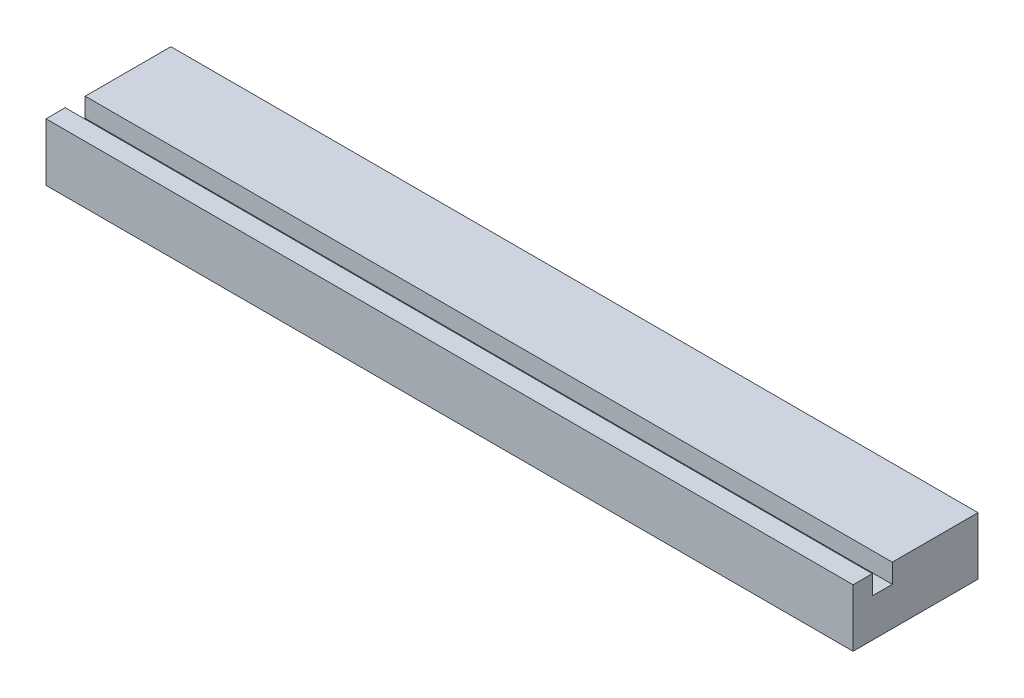
ISO-10303-21;
HEADER;
FILE_DESCRIPTION(('STEP AP214'),'2;1');
FILE_NAME('part.step','',(''),(''),'','','');
FILE_SCHEMA(('AUTOMOTIVE_DESIGN { 1 0 10303 214 1 1 1 1 }'));
ENDSEC;
DATA;
#1=APPLICATION_CONTEXT('core data for automotive mechanical design processes');
#2=APPLICATION_PROTOCOL_DEFINITION('international standard','automotive_design',2000,#1);
#3=PRODUCT_CONTEXT('',#1,'mechanical');
#4=PRODUCT('Part','Part','',(#3));
#5=PRODUCT_RELATED_PRODUCT_CATEGORY('part','',(#4));
#6=PRODUCT_DEFINITION_FORMATION('','',#4);
#7=PRODUCT_DEFINITION_CONTEXT('part definition',#1,'design');
#8=PRODUCT_DEFINITION('design','',#6,#7);
#9=PRODUCT_DEFINITION_SHAPE('','',#8);
#10=(LENGTH_UNIT() NAMED_UNIT(*) SI_UNIT(.MILLI.,.METRE.));
#11=(NAMED_UNIT(*) PLANE_ANGLE_UNIT() SI_UNIT($,.RADIAN.));
#12=(NAMED_UNIT(*) SI_UNIT($,.STERADIAN.) SOLID_ANGLE_UNIT());
#13=UNCERTAINTY_MEASURE_WITH_UNIT(LENGTH_MEASURE(1.E-05),#10,'distance_accuracy_value','');
#14=(GEOMETRIC_REPRESENTATION_CONTEXT(3) GLOBAL_UNCERTAINTY_ASSIGNED_CONTEXT((#13)) GLOBAL_UNIT_ASSIGNED_CONTEXT((#10,
#11,#12)) REPRESENTATION_CONTEXT('',''));
#15=CARTESIAN_POINT('',(0.,0.,0.));
#16=DIRECTION('',(0.,0.,1.));
#17=DIRECTION('',(1.,0.,0.));
#18=AXIS2_PLACEMENT_3D('',#15,#16,#17);
#19=CARTESIAN_POINT('',(-133.35,9.525,41.275));
#20=DIRECTION('',(0.,-1.,0.));
#21=DIRECTION('',(0.,0.,-1.));
#22=AXIS2_PLACEMENT_3D('',#19,#20,#21);
#23=PLANE('',#22);
#24=DIRECTION('',(0.,0.,-1.));
#25=VECTOR('',#24,1.);
#26=CARTESIAN_POINT('',(-133.35,9.525,41.275));
#27=LINE('',#26,#25);
#28=CARTESIAN_POINT('',(-133.35,9.525,28.321));
#29=VERTEX_POINT('',#28);
#30=CARTESIAN_POINT('',(-133.35,9.525,0.));
#31=VERTEX_POINT('',#30);
#32=EDGE_CURVE('E153',#29,#31,#27,.T.);
#33=ORIENTED_EDGE('',*,*,#32,.F.);
#34=DIRECTION('',(-1.,0.,0.));
#35=VECTOR('',#34,1.);
#36=CARTESIAN_POINT('',(-133.35,9.525,28.321));
#37=LINE('',#36,#35);
#38=CARTESIAN_POINT('',(133.35,9.525,28.321));
#39=VERTEX_POINT('',#38);
#40=EDGE_CURVE('E122',#39,#29,#37,.T.);
#41=ORIENTED_EDGE('',*,*,#40,.F.);
#42=DIRECTION('',(0.,0.,-1.));
#43=VECTOR('',#42,1.);
#44=CARTESIAN_POINT('',(133.35,9.525,41.275));
#45=LINE('',#44,#43);
#46=CARTESIAN_POINT('',(133.35,9.525,0.));
#47=VERTEX_POINT('',#46);
#48=EDGE_CURVE('E41',#39,#47,#45,.T.);
#49=ORIENTED_EDGE('',*,*,#48,.T.);
#50=DIRECTION('',(-1.,0.,0.));
#51=VECTOR('',#50,1.);
#52=CARTESIAN_POINT('',(-133.35,9.525,0.));
#53=LINE('',#52,#51);
#54=EDGE_CURVE('E144',#47,#31,#53,.T.);
#55=ORIENTED_EDGE('',*,*,#54,.T.);
#56=EDGE_LOOP('',(#33,#41,#49,#55));
#57=FACE_BOUND('',#56,.T.);
#58=ADVANCED_FACE('F33',(#57),#23,.F.);
#59=CARTESIAN_POINT('',(133.35,-9.525,41.275));
#60=DIRECTION('',(-1.,0.,0.));
#61=DIRECTION('',(0.,0.,1.));
#62=AXIS2_PLACEMENT_3D('',#59,#60,#61);
#63=PLANE('',#62);
#64=ORIENTED_EDGE('',*,*,#48,.F.);
#65=DIRECTION('',(0.,1.,0.));
#66=VECTOR('',#65,1.);
#67=CARTESIAN_POINT('',(133.35,3.175,28.321));
#68=LINE('',#67,#66);
#69=CARTESIAN_POINT('',(133.35,3.175,28.321));
#70=VERTEX_POINT('',#69);
#71=EDGE_CURVE('E129',#70,#39,#68,.T.);
#72=ORIENTED_EDGE('',*,*,#71,.F.);
#73=DIRECTION('',(0.,0.,-1.));
#74=VECTOR('',#73,1.);
#75=CARTESIAN_POINT('',(133.35,3.175,34.925));
#76=LINE('',#75,#74);
#77=CARTESIAN_POINT('',(133.35,3.175,34.925));
#78=VERTEX_POINT('',#77);
#79=EDGE_CURVE('E115',#78,#70,#76,.T.);
#80=ORIENTED_EDGE('',*,*,#79,.F.);
#81=DIRECTION('',(0.,1.,0.));
#82=VECTOR('',#81,1.);
#83=CARTESIAN_POINT('',(133.35,3.175,34.925));
#84=LINE('',#83,#82);
#85=CARTESIAN_POINT('',(133.35,9.525,34.925));
#86=VERTEX_POINT('',#85);
#87=EDGE_CURVE('E113',#78,#86,#84,.T.);
#88=ORIENTED_EDGE('',*,*,#87,.T.);
#89=CARTESIAN_POINT('',(133.35,9.525,41.275));
#90=VERTEX_POINT('',#89);
#91=EDGE_CURVE('E11',#90,#86,#45,.T.);
#92=ORIENTED_EDGE('',*,*,#91,.F.);
#93=DIRECTION('',(0.,1.,0.));
#94=VECTOR('',#93,1.);
#95=CARTESIAN_POINT('',(133.35,-9.525,41.275));
#96=LINE('',#95,#94);
#97=CARTESIAN_POINT('',(133.35,-9.525,41.275));
#98=VERTEX_POINT('',#97);
#99=EDGE_CURVE('E134',#98,#90,#96,.T.);
#100=ORIENTED_EDGE('',*,*,#99,.F.);
#101=DIRECTION('',(0.,0.,-1.));
#102=VECTOR('',#101,1.);
#103=CARTESIAN_POINT('',(133.35,-9.525,41.275));
#104=LINE('',#103,#102);
#105=CARTESIAN_POINT('',(133.35,-9.525,0.));
#106=VERTEX_POINT('',#105);
#107=EDGE_CURVE('E140',#98,#106,#104,.T.);
#108=ORIENTED_EDGE('',*,*,#107,.T.);
#109=DIRECTION('',(0.,1.,0.));
#110=VECTOR('',#109,1.);
#111=CARTESIAN_POINT('',(133.35,-9.525,0.));
#112=LINE('',#111,#110);
#113=EDGE_CURVE('E141',#106,#47,#112,.T.);
#114=ORIENTED_EDGE('',*,*,#113,.T.);
#115=EDGE_LOOP('',(#64,#72,#80,#88,#92,#100,#108,#114));
#116=FACE_BOUND('',#115,.T.);
#117=ADVANCED_FACE('F35',(#116),#63,.F.);
#118=ORIENTED_EDGE('',*,*,#91,.T.);
#119=DIRECTION('',(1.,0.,0.));
#120=VECTOR('',#119,1.);
#121=CARTESIAN_POINT('',(-133.35,9.525,34.925));
#122=LINE('',#121,#120);
#123=CARTESIAN_POINT('',(-133.35,9.525,34.925));
#124=VERTEX_POINT('',#123);
#125=EDGE_CURVE('E171',#124,#86,#122,.T.);
#126=ORIENTED_EDGE('',*,*,#125,.F.);
#127=CARTESIAN_POINT('',(-133.35,9.525,41.275));
#128=VERTEX_POINT('',#127);
#129=EDGE_CURVE('E127',#128,#124,#27,.T.);
#130=ORIENTED_EDGE('',*,*,#129,.F.);
#131=DIRECTION('',(-1.,0.,0.));
#132=VECTOR('',#131,1.);
#133=CARTESIAN_POINT('',(-133.35,9.525,41.275));
#134=LINE('',#133,#132);
#135=EDGE_CURVE('E85',#90,#128,#134,.T.);
#136=ORIENTED_EDGE('',*,*,#135,.F.);
#137=EDGE_LOOP('',(#118,#126,#130,#136));
#138=FACE_BOUND('',#137,.T.);
#139=ADVANCED_FACE('F170',(#138),#23,.F.);
#140=CARTESIAN_POINT('',(-133.35,-9.525,41.275));
#141=DIRECTION('',(1.,0.,0.));
#142=DIRECTION('',(0.,0.,-1.));
#143=AXIS2_PLACEMENT_3D('',#140,#141,#142);
#144=PLANE('',#143);
#145=DIRECTION('',(0.,0.,1.));
#146=VECTOR('',#145,1.);
#147=CARTESIAN_POINT('',(-133.35,3.175,34.925));
#148=LINE('',#147,#146);
#149=CARTESIAN_POINT('',(-133.35,3.175,28.321));
#150=VERTEX_POINT('',#149);
#151=CARTESIAN_POINT('',(-133.35,3.175,34.925));
#152=VERTEX_POINT('',#151);
#153=EDGE_CURVE('E116',#150,#152,#148,.T.);
#154=ORIENTED_EDGE('',*,*,#153,.F.);
#155=DIRECTION('',(0.,1.,0.));
#156=VECTOR('',#155,1.);
#157=CARTESIAN_POINT('',(-133.35,3.175,28.321));
#158=LINE('',#157,#156);
#159=EDGE_CURVE('E145',#150,#29,#158,.T.);
#160=ORIENTED_EDGE('',*,*,#159,.T.);
#161=ORIENTED_EDGE('',*,*,#32,.T.);
#162=DIRECTION('',(0.,-1.,0.));
#163=VECTOR('',#162,1.);
#164=CARTESIAN_POINT('',(-133.35,-9.525,0.));
#165=LINE('',#164,#163);
#166=CARTESIAN_POINT('',(-133.35,-9.525,0.));
#167=VERTEX_POINT('',#166);
#168=EDGE_CURVE('E148',#31,#167,#165,.T.);
#169=ORIENTED_EDGE('',*,*,#168,.T.);
#170=DIRECTION('',(0.,0.,-1.));
#171=VECTOR('',#170,1.);
#172=CARTESIAN_POINT('',(-133.35,-9.525,41.275));
#173=LINE('',#172,#171);
#174=CARTESIAN_POINT('',(-133.35,-9.525,41.275));
#175=VERTEX_POINT('',#174);
#176=EDGE_CURVE('E152',#175,#167,#173,.T.);
#177=ORIENTED_EDGE('',*,*,#176,.F.);
#178=DIRECTION('',(0.,-1.,0.));
#179=VECTOR('',#178,1.);
#180=CARTESIAN_POINT('',(-133.35,-9.525,41.275));
#181=LINE('',#180,#179);
#182=EDGE_CURVE('E137',#128,#175,#181,.T.);
#183=ORIENTED_EDGE('',*,*,#182,.F.);
#184=ORIENTED_EDGE('',*,*,#129,.T.);
#185=DIRECTION('',(0.,1.,0.));
#186=VECTOR('',#185,1.);
#187=CARTESIAN_POINT('',(-133.35,3.175,34.925));
#188=LINE('',#187,#186);
#189=EDGE_CURVE('E110',#152,#124,#188,.T.);
#190=ORIENTED_EDGE('',*,*,#189,.F.);
#191=EDGE_LOOP('',(#154,#160,#161,#169,#177,#183,#184,#190));
#192=FACE_BOUND('',#191,.T.);
#193=ADVANCED_FACE('F125',(#192),#144,.F.);
#194=CARTESIAN_POINT('',(-133.35,-9.525,41.275));
#195=DIRECTION('',(0.,1.,0.));
#196=DIRECTION('',(0.,0.,1.));
#197=AXIS2_PLACEMENT_3D('',#194,#195,#196);
#198=PLANE('',#197);
#199=DIRECTION('',(1.,0.,0.));
#200=VECTOR('',#199,1.);
#201=CARTESIAN_POINT('',(-133.35,-9.525,0.));
#202=LINE('',#201,#200);
#203=EDGE_CURVE('E78',#167,#106,#202,.T.);
#204=ORIENTED_EDGE('',*,*,#203,.T.);
#205=ORIENTED_EDGE('',*,*,#107,.F.);
#206=DIRECTION('',(1.,0.,0.));
#207=VECTOR('',#206,1.);
#208=CARTESIAN_POINT('',(-133.35,-9.525,41.275));
#209=LINE('',#208,#207);
#210=EDGE_CURVE('E57',#175,#98,#209,.T.);
#211=ORIENTED_EDGE('',*,*,#210,.F.);
#212=ORIENTED_EDGE('',*,*,#176,.T.);
#213=EDGE_LOOP('',(#204,#205,#211,#212));
#214=FACE_BOUND('',#213,.T.);
#215=ADVANCED_FACE('F168',(#214),#198,.F.);
#216=CARTESIAN_POINT('',(0.,0.,41.275));
#217=DIRECTION('',(0.,0.,-1.));
#218=DIRECTION('',(-1.,0.,0.));
#219=AXIS2_PLACEMENT_3D('',#216,#217,#218);
#220=PLANE('',#219);
#221=ORIENTED_EDGE('',*,*,#99,.T.);
#222=ORIENTED_EDGE('',*,*,#135,.T.);
#223=ORIENTED_EDGE('',*,*,#182,.T.);
#224=ORIENTED_EDGE('',*,*,#210,.T.);
#225=EDGE_LOOP('',(#221,#222,#223,#224));
#226=FACE_BOUND('',#225,.T.);
#227=ADVANCED_FACE('F169',(#226),#220,.F.);
#228=CARTESIAN_POINT('',(0.,0.,0.));
#229=DIRECTION('',(0.,0.,-1.));
#230=DIRECTION('',(-1.,0.,0.));
#231=AXIS2_PLACEMENT_3D('',#228,#229,#230);
#232=PLANE('',#231);
#233=ORIENTED_EDGE('',*,*,#113,.F.);
#234=ORIENTED_EDGE('',*,*,#203,.F.);
#235=ORIENTED_EDGE('',*,*,#168,.F.);
#236=ORIENTED_EDGE('',*,*,#54,.F.);
#237=EDGE_LOOP('',(#233,#234,#235,#236));
#238=FACE_BOUND('',#237,.T.);
#239=ADVANCED_FACE('F163',(#238),#232,.T.);
#240=CARTESIAN_POINT('',(-133.35,3.175,28.321));
#241=DIRECTION('',(0.,0.,-1.));
#242=DIRECTION('',(-1.,0.,0.));
#243=AXIS2_PLACEMENT_3D('',#240,#241,#242);
#244=PLANE('',#243);
#245=ORIENTED_EDGE('',*,*,#40,.T.);
#246=ORIENTED_EDGE('',*,*,#159,.F.);
#247=DIRECTION('',(-1.,0.,0.));
#248=VECTOR('',#247,1.);
#249=CARTESIAN_POINT('',(-133.35,3.175,28.321));
#250=LINE('',#249,#248);
#251=EDGE_CURVE('E48',#70,#150,#250,.T.);
#252=ORIENTED_EDGE('',*,*,#251,.F.);
#253=ORIENTED_EDGE('',*,*,#71,.T.);
#254=EDGE_LOOP('',(#245,#246,#252,#253));
#255=FACE_BOUND('',#254,.T.);
#256=ADVANCED_FACE('F177',(#255),#244,.F.);
#257=CARTESIAN_POINT('',(-133.35,3.175,34.925));
#258=DIRECTION('',(0.,0.,1.));
#259=DIRECTION('',(1.,0.,0.));
#260=AXIS2_PLACEMENT_3D('',#257,#258,#259);
#261=PLANE('',#260);
#262=ORIENTED_EDGE('',*,*,#125,.T.);
#263=ORIENTED_EDGE('',*,*,#87,.F.);
#264=DIRECTION('',(1.,0.,0.));
#265=VECTOR('',#264,1.);
#266=CARTESIAN_POINT('',(-133.35,3.175,34.925));
#267=LINE('',#266,#265);
#268=EDGE_CURVE('E107',#152,#78,#267,.T.);
#269=ORIENTED_EDGE('',*,*,#268,.F.);
#270=ORIENTED_EDGE('',*,*,#189,.T.);
#271=EDGE_LOOP('',(#262,#263,#269,#270));
#272=FACE_BOUND('',#271,.T.);
#273=ADVANCED_FACE('F108',(#272),#261,.F.);
#274=CARTESIAN_POINT('',(0.,3.175,0.));
#275=DIRECTION('',(0.,-1.,0.));
#276=DIRECTION('',(0.,0.,-1.));
#277=AXIS2_PLACEMENT_3D('',#274,#275,#276);
#278=PLANE('',#277);
#279=ORIENTED_EDGE('',*,*,#153,.T.);
#280=ORIENTED_EDGE('',*,*,#268,.T.);
#281=ORIENTED_EDGE('',*,*,#79,.T.);
#282=ORIENTED_EDGE('',*,*,#251,.T.);
#283=EDGE_LOOP('',(#279,#280,#281,#282));
#284=FACE_BOUND('',#283,.T.);
#285=ADVANCED_FACE('F119',(#284),#278,.F.);
#286=CLOSED_SHELL('',(#58,#117,#139,#193,#215,#227,#239,#256,#273,#285));
#287=MANIFOLD_SOLID_BREP('B2',#286);
#288=ADVANCED_BREP_SHAPE_REPRESENTATION('',(#18,#287),#14);
#289=SHAPE_DEFINITION_REPRESENTATION(#9,#288);
ENDSEC;
END-ISO-10303-21;
